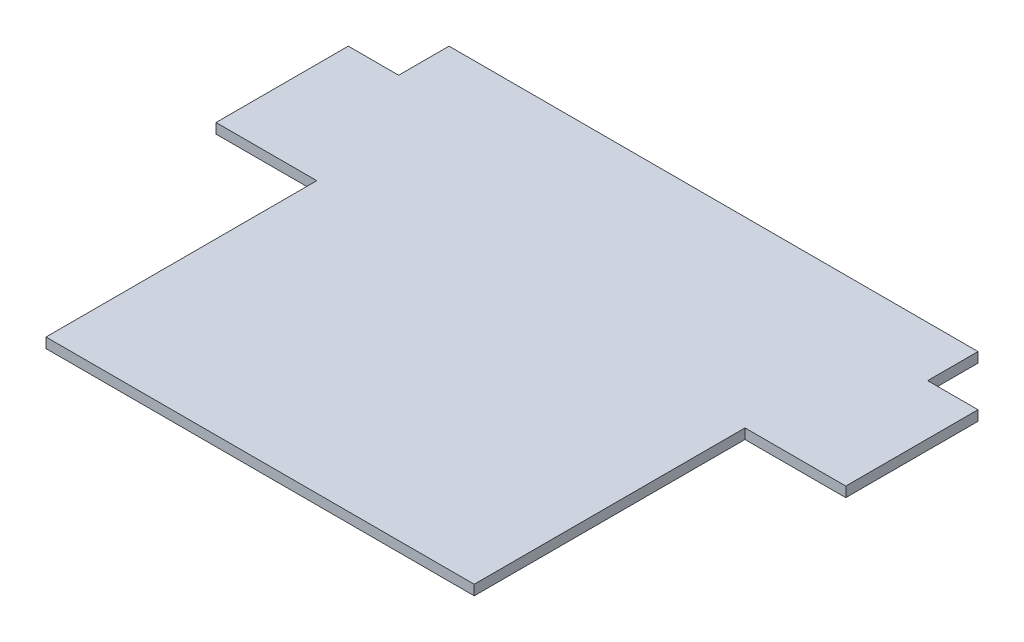
ISO-10303-21;
HEADER;
FILE_DESCRIPTION(('STEP AP214'),'2;1');
FILE_NAME('part.step','',(''),(''),'','','');
FILE_SCHEMA(('AUTOMOTIVE_DESIGN { 1 0 10303 214 1 1 1 1 }'));
ENDSEC;
DATA;
#1=APPLICATION_CONTEXT('core data for automotive mechanical design processes');
#2=APPLICATION_PROTOCOL_DEFINITION('international standard','automotive_design',2000,#1);
#3=PRODUCT_CONTEXT('',#1,'mechanical');
#4=PRODUCT('Part','Part','',(#3));
#5=PRODUCT_RELATED_PRODUCT_CATEGORY('part','',(#4));
#6=PRODUCT_DEFINITION_FORMATION('','',#4);
#7=PRODUCT_DEFINITION_CONTEXT('part definition',#1,'design');
#8=PRODUCT_DEFINITION('design','',#6,#7);
#9=PRODUCT_DEFINITION_SHAPE('','',#8);
#10=(LENGTH_UNIT() NAMED_UNIT(*) SI_UNIT(.MILLI.,.METRE.));
#11=(NAMED_UNIT(*) PLANE_ANGLE_UNIT() SI_UNIT($,.RADIAN.));
#12=(NAMED_UNIT(*) SI_UNIT($,.STERADIAN.) SOLID_ANGLE_UNIT());
#13=UNCERTAINTY_MEASURE_WITH_UNIT(LENGTH_MEASURE(1.E-05),#10,'distance_accuracy_value','');
#14=(GEOMETRIC_REPRESENTATION_CONTEXT(3) GLOBAL_UNCERTAINTY_ASSIGNED_CONTEXT((#13)) GLOBAL_UNIT_ASSIGNED_CONTEXT((#10,
#11,#12)) REPRESENTATION_CONTEXT('',''));
#15=CARTESIAN_POINT('',(0.,0.,0.));
#16=DIRECTION('',(0.,0.,1.));
#17=DIRECTION('',(1.,0.,0.));
#18=AXIS2_PLACEMENT_3D('',#15,#16,#17);
#19=CARTESIAN_POINT('',(-34.,1.6,-43.));
#20=DIRECTION('',(0.,0.,-1.));
#21=DIRECTION('',(-1.,0.,0.));
#22=AXIS2_PLACEMENT_3D('',#19,#20,#21);
#23=PLANE('',#22);
#24=DIRECTION('',(1.,0.,0.));
#25=VECTOR('',#24,1.);
#26=CARTESIAN_POINT('',(-34.,0.,-43.));
#27=LINE('',#26,#25);
#28=CARTESIAN_POINT('',(-50.,0.,-43.));
#29=VERTEX_POINT('',#28);
#30=CARTESIAN_POINT('',(-34.,0.,-43.));
#31=VERTEX_POINT('',#30);
#32=EDGE_CURVE('E153',#29,#31,#27,.T.);
#33=ORIENTED_EDGE('',*,*,#32,.T.);
#34=DIRECTION('',(0.,-1.,0.));
#35=VECTOR('',#34,1.);
#36=CARTESIAN_POINT('',(-34.,1.6,-43.));
#37=LINE('',#36,#35);
#38=CARTESIAN_POINT('',(-34.,1.6,-43.));
#39=VERTEX_POINT('',#38);
#40=EDGE_CURVE('E11',#39,#31,#37,.T.);
#41=ORIENTED_EDGE('',*,*,#40,.F.);
#42=DIRECTION('',(1.,0.,0.));
#43=VECTOR('',#42,1.);
#44=CARTESIAN_POINT('',(-34.,1.6,-43.));
#45=LINE('',#44,#43);
#46=CARTESIAN_POINT('',(-50.,1.6,-43.));
#47=VERTEX_POINT('',#46);
#48=EDGE_CURVE('E175',#47,#39,#45,.T.);
#49=ORIENTED_EDGE('',*,*,#48,.F.);
#50=DIRECTION('',(0.,-1.,0.));
#51=VECTOR('',#50,1.);
#52=CARTESIAN_POINT('',(-50.,1.6,-43.));
#53=LINE('',#52,#51);
#54=EDGE_CURVE('E149',#47,#29,#53,.T.);
#55=ORIENTED_EDGE('',*,*,#54,.T.);
#56=EDGE_LOOP('',(#33,#41,#49,#55));
#57=FACE_BOUND('',#56,.T.);
#58=ADVANCED_FACE('F33',(#57),#23,.F.);
#59=CARTESIAN_POINT('',(-34.,1.6,-43.));
#60=DIRECTION('',(1.,0.,0.));
#61=DIRECTION('',(0.,0.,-1.));
#62=AXIS2_PLACEMENT_3D('',#59,#60,#61);
#63=PLANE('',#62);
#64=DIRECTION('',(0.,0.,1.));
#65=VECTOR('',#64,1.);
#66=CARTESIAN_POINT('',(-34.,0.,-43.));
#67=LINE('',#66,#65);
#68=CARTESIAN_POINT('',(-34.,0.,0.));
#69=VERTEX_POINT('',#68);
#70=EDGE_CURVE('E156',#31,#69,#67,.T.);
#71=ORIENTED_EDGE('',*,*,#70,.T.);
#72=DIRECTION('',(0.,-1.,0.));
#73=VECTOR('',#72,1.);
#74=CARTESIAN_POINT('',(-34.,1.6,0.));
#75=LINE('',#74,#73);
#76=CARTESIAN_POINT('',(-34.,1.6,0.));
#77=VERTEX_POINT('',#76);
#78=EDGE_CURVE('E41',#77,#69,#75,.T.);
#79=ORIENTED_EDGE('',*,*,#78,.F.);
#80=DIRECTION('',(0.,0.,1.));
#81=VECTOR('',#80,1.);
#82=CARTESIAN_POINT('',(-34.,1.6,-43.));
#83=LINE('',#82,#81);
#84=EDGE_CURVE('E104',#39,#77,#83,.T.);
#85=ORIENTED_EDGE('',*,*,#84,.F.);
#86=ORIENTED_EDGE('',*,*,#40,.T.);
#87=EDGE_LOOP('',(#71,#79,#85,#86));
#88=FACE_BOUND('',#87,.T.);
#89=ADVANCED_FACE('F253',(#88),#63,.F.);
#90=CARTESIAN_POINT('',(-34.,1.6,0.));
#91=DIRECTION('',(0.,0.,-1.));
#92=DIRECTION('',(-1.,0.,0.));
#93=AXIS2_PLACEMENT_3D('',#90,#91,#92);
#94=PLANE('',#93);
#95=DIRECTION('',(1.,0.,0.));
#96=VECTOR('',#95,1.);
#97=CARTESIAN_POINT('',(-34.,0.,0.));
#98=LINE('',#97,#96);
#99=CARTESIAN_POINT('',(34.,0.,0.));
#100=VERTEX_POINT('',#99);
#101=EDGE_CURVE('E158',#69,#100,#98,.T.);
#102=ORIENTED_EDGE('',*,*,#101,.T.);
#103=DIRECTION('',(0.,-1.,0.));
#104=VECTOR('',#103,1.);
#105=CARTESIAN_POINT('',(34.,1.6,0.));
#106=LINE('',#105,#104);
#107=CARTESIAN_POINT('',(34.,1.6,0.));
#108=VERTEX_POINT('',#107);
#109=EDGE_CURVE('E194',#108,#100,#106,.T.);
#110=ORIENTED_EDGE('',*,*,#109,.F.);
#111=DIRECTION('',(1.,0.,0.));
#112=VECTOR('',#111,1.);
#113=CARTESIAN_POINT('',(-34.,1.6,0.));
#114=LINE('',#113,#112);
#115=EDGE_CURVE('E202',#77,#108,#114,.T.);
#116=ORIENTED_EDGE('',*,*,#115,.F.);
#117=ORIENTED_EDGE('',*,*,#78,.T.);
#118=EDGE_LOOP('',(#102,#110,#116,#117));
#119=FACE_BOUND('',#118,.T.);
#120=ADVANCED_FACE('F200',(#119),#94,.F.);
#121=CARTESIAN_POINT('',(34.,1.6,-43.));
#122=DIRECTION('',(-1.,0.,0.));
#123=DIRECTION('',(0.,0.,1.));
#124=AXIS2_PLACEMENT_3D('',#121,#122,#123);
#125=PLANE('',#124);
#126=DIRECTION('',(0.,0.,-1.));
#127=VECTOR('',#126,1.);
#128=CARTESIAN_POINT('',(34.,0.,-43.));
#129=LINE('',#128,#127);
#130=CARTESIAN_POINT('',(34.,0.,-43.));
#131=VERTEX_POINT('',#130);
#132=EDGE_CURVE('E160',#100,#131,#129,.T.);
#133=ORIENTED_EDGE('',*,*,#132,.T.);
#134=DIRECTION('',(0.,-1.,0.));
#135=VECTOR('',#134,1.);
#136=CARTESIAN_POINT('',(34.,1.6,-43.));
#137=LINE('',#136,#135);
#138=CARTESIAN_POINT('',(34.,1.6,-43.));
#139=VERTEX_POINT('',#138);
#140=EDGE_CURVE('E191',#139,#131,#137,.T.);
#141=ORIENTED_EDGE('',*,*,#140,.F.);
#142=DIRECTION('',(0.,0.,-1.));
#143=VECTOR('',#142,1.);
#144=CARTESIAN_POINT('',(34.,1.6,-43.));
#145=LINE('',#144,#143);
#146=EDGE_CURVE('E220',#108,#139,#145,.T.);
#147=ORIENTED_EDGE('',*,*,#146,.F.);
#148=ORIENTED_EDGE('',*,*,#109,.T.);
#149=EDGE_LOOP('',(#133,#141,#147,#148));
#150=FACE_BOUND('',#149,.T.);
#151=ADVANCED_FACE('F211',(#150),#125,.F.);
#152=CARTESIAN_POINT('',(34.,1.6,-43.));
#153=DIRECTION('',(0.,0.,-1.));
#154=DIRECTION('',(-1.,0.,0.));
#155=AXIS2_PLACEMENT_3D('',#152,#153,#154);
#156=PLANE('',#155);
#157=DIRECTION('',(1.,0.,0.));
#158=VECTOR('',#157,1.);
#159=CARTESIAN_POINT('',(34.,0.,-43.));
#160=LINE('',#159,#158);
#161=CARTESIAN_POINT('',(50.,0.,-43.));
#162=VERTEX_POINT('',#161);
#163=EDGE_CURVE('E162',#131,#162,#160,.T.);
#164=ORIENTED_EDGE('',*,*,#163,.T.);
#165=DIRECTION('',(0.,-1.,0.));
#166=VECTOR('',#165,1.);
#167=CARTESIAN_POINT('',(50.,1.6,-43.));
#168=LINE('',#167,#166);
#169=CARTESIAN_POINT('',(50.,1.6,-43.));
#170=VERTEX_POINT('',#169);
#171=EDGE_CURVE('E188',#170,#162,#168,.T.);
#172=ORIENTED_EDGE('',*,*,#171,.F.);
#173=DIRECTION('',(1.,0.,0.));
#174=VECTOR('',#173,1.);
#175=CARTESIAN_POINT('',(34.,1.6,-43.));
#176=LINE('',#175,#174);
#177=EDGE_CURVE('E217',#139,#170,#176,.T.);
#178=ORIENTED_EDGE('',*,*,#177,.F.);
#179=ORIENTED_EDGE('',*,*,#140,.T.);
#180=EDGE_LOOP('',(#164,#172,#178,#179));
#181=FACE_BOUND('',#180,.T.);
#182=ADVANCED_FACE('F215',(#181),#156,.F.);
#183=CARTESIAN_POINT('',(50.,1.6,-43.));
#184=DIRECTION('',(-1.,0.,0.));
#185=DIRECTION('',(0.,0.,1.));
#186=AXIS2_PLACEMENT_3D('',#183,#184,#185);
#187=PLANE('',#186);
#188=DIRECTION('',(0.,0.,-1.));
#189=VECTOR('',#188,1.);
#190=CARTESIAN_POINT('',(50.,0.,-43.));
#191=LINE('',#190,#189);
#192=CARTESIAN_POINT('',(50.,0.,-64.));
#193=VERTEX_POINT('',#192);
#194=EDGE_CURVE('E164',#162,#193,#191,.T.);
#195=ORIENTED_EDGE('',*,*,#194,.T.);
#196=DIRECTION('',(0.,-1.,0.));
#197=VECTOR('',#196,1.);
#198=CARTESIAN_POINT('',(50.,1.6,-64.));
#199=LINE('',#198,#197);
#200=CARTESIAN_POINT('',(50.,1.6,-64.));
#201=VERTEX_POINT('',#200);
#202=EDGE_CURVE('E185',#201,#193,#199,.T.);
#203=ORIENTED_EDGE('',*,*,#202,.F.);
#204=DIRECTION('',(0.,0.,-1.));
#205=VECTOR('',#204,1.);
#206=CARTESIAN_POINT('',(50.,1.6,-43.));
#207=LINE('',#206,#205);
#208=EDGE_CURVE('E219',#170,#201,#207,.T.);
#209=ORIENTED_EDGE('',*,*,#208,.F.);
#210=ORIENTED_EDGE('',*,*,#171,.T.);
#211=EDGE_LOOP('',(#195,#203,#209,#210));
#212=FACE_BOUND('',#211,.T.);
#213=ADVANCED_FACE('F266',(#212),#187,.F.);
#214=CARTESIAN_POINT('',(50.,1.6,-64.));
#215=DIRECTION('',(0.,0.,1.));
#216=DIRECTION('',(1.,0.,0.));
#217=AXIS2_PLACEMENT_3D('',#214,#215,#216);
#218=PLANE('',#217);
#219=DIRECTION('',(-1.,0.,0.));
#220=VECTOR('',#219,1.);
#221=CARTESIAN_POINT('',(50.,0.,-64.));
#222=LINE('',#221,#220);
#223=CARTESIAN_POINT('',(42.,0.,-64.));
#224=VERTEX_POINT('',#223);
#225=EDGE_CURVE('E166',#193,#224,#222,.T.);
#226=ORIENTED_EDGE('',*,*,#225,.T.);
#227=DIRECTION('',(0.,-1.,0.));
#228=VECTOR('',#227,1.);
#229=CARTESIAN_POINT('',(42.,1.6,-64.));
#230=LINE('',#229,#228);
#231=CARTESIAN_POINT('',(42.,1.6,-64.));
#232=VERTEX_POINT('',#231);
#233=EDGE_CURVE('E182',#232,#224,#230,.T.);
#234=ORIENTED_EDGE('',*,*,#233,.F.);
#235=DIRECTION('',(-1.,0.,0.));
#236=VECTOR('',#235,1.);
#237=CARTESIAN_POINT('',(50.,1.6,-64.));
#238=LINE('',#237,#236);
#239=EDGE_CURVE('E222',#201,#232,#238,.T.);
#240=ORIENTED_EDGE('',*,*,#239,.F.);
#241=ORIENTED_EDGE('',*,*,#202,.T.);
#242=EDGE_LOOP('',(#226,#234,#240,#241));
#243=FACE_BOUND('',#242,.T.);
#244=ADVANCED_FACE('F269',(#243),#218,.F.);
#245=CARTESIAN_POINT('',(42.,1.6,-64.));
#246=DIRECTION('',(-1.,0.,0.));
#247=DIRECTION('',(0.,0.,1.));
#248=AXIS2_PLACEMENT_3D('',#245,#246,#247);
#249=PLANE('',#248);
#250=DIRECTION('',(0.,0.,-1.));
#251=VECTOR('',#250,1.);
#252=CARTESIAN_POINT('',(42.,0.,-64.));
#253=LINE('',#252,#251);
#254=CARTESIAN_POINT('',(42.,0.,-72.));
#255=VERTEX_POINT('',#254);
#256=EDGE_CURVE('E168',#224,#255,#253,.T.);
#257=ORIENTED_EDGE('',*,*,#256,.T.);
#258=DIRECTION('',(0.,-1.,0.));
#259=VECTOR('',#258,1.);
#260=CARTESIAN_POINT('',(42.,1.6,-72.));
#261=LINE('',#260,#259);
#262=CARTESIAN_POINT('',(42.,1.6,-72.));
#263=VERTEX_POINT('',#262);
#264=EDGE_CURVE('E179',#263,#255,#261,.T.);
#265=ORIENTED_EDGE('',*,*,#264,.F.);
#266=DIRECTION('',(0.,0.,-1.));
#267=VECTOR('',#266,1.);
#268=CARTESIAN_POINT('',(42.,1.6,-64.));
#269=LINE('',#268,#267);
#270=EDGE_CURVE('E228',#232,#263,#269,.T.);
#271=ORIENTED_EDGE('',*,*,#270,.F.);
#272=ORIENTED_EDGE('',*,*,#233,.T.);
#273=EDGE_LOOP('',(#257,#265,#271,#272));
#274=FACE_BOUND('',#273,.T.);
#275=ADVANCED_FACE('F234',(#274),#249,.F.);
#276=CARTESIAN_POINT('',(-42.,1.6,-72.));
#277=DIRECTION('',(0.,0.,1.));
#278=DIRECTION('',(1.,0.,0.));
#279=AXIS2_PLACEMENT_3D('',#276,#277,#278);
#280=PLANE('',#279);
#281=DIRECTION('',(-1.,0.,0.));
#282=VECTOR('',#281,1.);
#283=CARTESIAN_POINT('',(-42.,0.,-72.));
#284=LINE('',#283,#282);
#285=CARTESIAN_POINT('',(-42.,0.,-72.));
#286=VERTEX_POINT('',#285);
#287=EDGE_CURVE('E170',#255,#286,#284,.T.);
#288=ORIENTED_EDGE('',*,*,#287,.T.);
#289=DIRECTION('',(0.,-1.,0.));
#290=VECTOR('',#289,1.);
#291=CARTESIAN_POINT('',(-42.,1.6,-72.));
#292=LINE('',#291,#290);
#293=CARTESIAN_POINT('',(-42.,1.6,-72.));
#294=VERTEX_POINT('',#293);
#295=EDGE_CURVE('E144',#294,#286,#292,.T.);
#296=ORIENTED_EDGE('',*,*,#295,.F.);
#297=DIRECTION('',(-1.,0.,0.));
#298=VECTOR('',#297,1.);
#299=CARTESIAN_POINT('',(-42.,1.6,-72.));
#300=LINE('',#299,#298);
#301=EDGE_CURVE('E135',#263,#294,#300,.T.);
#302=ORIENTED_EDGE('',*,*,#301,.F.);
#303=ORIENTED_EDGE('',*,*,#264,.T.);
#304=EDGE_LOOP('',(#288,#296,#302,#303));
#305=FACE_BOUND('',#304,.T.);
#306=ADVANCED_FACE('F238',(#305),#280,.F.);
#307=CARTESIAN_POINT('',(-42.,1.6,-64.));
#308=DIRECTION('',(1.,0.,0.));
#309=DIRECTION('',(0.,0.,-1.));
#310=AXIS2_PLACEMENT_3D('',#307,#308,#309);
#311=PLANE('',#310);
#312=DIRECTION('',(0.,0.,1.));
#313=VECTOR('',#312,1.);
#314=CARTESIAN_POINT('',(-42.,0.,-64.));
#315=LINE('',#314,#313);
#316=CARTESIAN_POINT('',(-42.,0.,-64.));
#317=VERTEX_POINT('',#316);
#318=EDGE_CURVE('E143',#286,#317,#315,.T.);
#319=ORIENTED_EDGE('',*,*,#318,.T.);
#320=DIRECTION('',(0.,-1.,0.));
#321=VECTOR('',#320,1.);
#322=CARTESIAN_POINT('',(-42.,1.6,-64.));
#323=LINE('',#322,#321);
#324=CARTESIAN_POINT('',(-42.,1.6,-64.));
#325=VERTEX_POINT('',#324);
#326=EDGE_CURVE('E140',#325,#317,#323,.T.);
#327=ORIENTED_EDGE('',*,*,#326,.F.);
#328=DIRECTION('',(0.,0.,1.));
#329=VECTOR('',#328,1.);
#330=CARTESIAN_POINT('',(-42.,1.6,-64.));
#331=LINE('',#330,#329);
#332=EDGE_CURVE('E129',#294,#325,#331,.T.);
#333=ORIENTED_EDGE('',*,*,#332,.F.);
#334=ORIENTED_EDGE('',*,*,#295,.T.);
#335=EDGE_LOOP('',(#319,#327,#333,#334));
#336=FACE_BOUND('',#335,.T.);
#337=ADVANCED_FACE('F141',(#336),#311,.F.);
#338=CARTESIAN_POINT('',(-50.,1.6,-64.));
#339=DIRECTION('',(0.,0.,1.));
#340=DIRECTION('',(1.,0.,0.));
#341=AXIS2_PLACEMENT_3D('',#338,#339,#340);
#342=PLANE('',#341);
#343=DIRECTION('',(-1.,0.,0.));
#344=VECTOR('',#343,1.);
#345=CARTESIAN_POINT('',(-50.,0.,-64.));
#346=LINE('',#345,#344);
#347=CARTESIAN_POINT('',(-50.,0.,-64.));
#348=VERTEX_POINT('',#347);
#349=EDGE_CURVE('E90',#317,#348,#346,.T.);
#350=ORIENTED_EDGE('',*,*,#349,.T.);
#351=DIRECTION('',(0.,-1.,0.));
#352=VECTOR('',#351,1.);
#353=CARTESIAN_POINT('',(-50.,1.6,-64.));
#354=LINE('',#353,#352);
#355=CARTESIAN_POINT('',(-50.,1.6,-64.));
#356=VERTEX_POINT('',#355);
#357=EDGE_CURVE('E145',#356,#348,#354,.T.);
#358=ORIENTED_EDGE('',*,*,#357,.F.);
#359=DIRECTION('',(-1.,0.,0.));
#360=VECTOR('',#359,1.);
#361=CARTESIAN_POINT('',(-50.,1.6,-64.));
#362=LINE('',#361,#360);
#363=EDGE_CURVE('E133',#325,#356,#362,.T.);
#364=ORIENTED_EDGE('',*,*,#363,.F.);
#365=ORIENTED_EDGE('',*,*,#326,.T.);
#366=EDGE_LOOP('',(#350,#358,#364,#365));
#367=FACE_BOUND('',#366,.T.);
#368=ADVANCED_FACE('F147',(#367),#342,.F.);
#369=CARTESIAN_POINT('',(-50.,1.6,-43.));
#370=DIRECTION('',(1.,0.,0.));
#371=DIRECTION('',(0.,0.,-1.));
#372=AXIS2_PLACEMENT_3D('',#369,#370,#371);
#373=PLANE('',#372);
#374=DIRECTION('',(0.,0.,1.));
#375=VECTOR('',#374,1.);
#376=CARTESIAN_POINT('',(-50.,0.,-43.));
#377=LINE('',#376,#375);
#378=EDGE_CURVE('E96',#348,#29,#377,.T.);
#379=ORIENTED_EDGE('',*,*,#378,.T.);
#380=ORIENTED_EDGE('',*,*,#54,.F.);
#381=DIRECTION('',(0.,0.,1.));
#382=VECTOR('',#381,1.);
#383=CARTESIAN_POINT('',(-50.,1.6,-43.));
#384=LINE('',#383,#382);
#385=EDGE_CURVE('E49',#356,#47,#384,.T.);
#386=ORIENTED_EDGE('',*,*,#385,.F.);
#387=ORIENTED_EDGE('',*,*,#357,.T.);
#388=EDGE_LOOP('',(#379,#380,#386,#387));
#389=FACE_BOUND('',#388,.T.);
#390=ADVANCED_FACE('F242',(#389),#373,.F.);
#391=CARTESIAN_POINT('',(0.,1.6,0.));
#392=DIRECTION('',(0.,-1.,0.));
#393=DIRECTION('',(0.,0.,-1.));
#394=AXIS2_PLACEMENT_3D('',#391,#392,#393);
#395=PLANE('',#394);
#396=ORIENTED_EDGE('',*,*,#48,.T.);
#397=ORIENTED_EDGE('',*,*,#84,.T.);
#398=ORIENTED_EDGE('',*,*,#115,.T.);
#399=ORIENTED_EDGE('',*,*,#146,.T.);
#400=ORIENTED_EDGE('',*,*,#177,.T.);
#401=ORIENTED_EDGE('',*,*,#208,.T.);
#402=ORIENTED_EDGE('',*,*,#239,.T.);
#403=ORIENTED_EDGE('',*,*,#270,.T.);
#404=ORIENTED_EDGE('',*,*,#301,.T.);
#405=ORIENTED_EDGE('',*,*,#332,.T.);
#406=ORIENTED_EDGE('',*,*,#363,.T.);
#407=ORIENTED_EDGE('',*,*,#385,.T.);
#408=EDGE_LOOP('',(#396,#397,#398,#399,#400,#401,#402,#403,#404,#405,#406,#407));
#409=FACE_BOUND('',#408,.T.);
#410=ADVANCED_FACE('F131',(#409),#395,.F.);
#411=CARTESIAN_POINT('',(0.,0.,0.));
#412=DIRECTION('',(0.,-1.,0.));
#413=DIRECTION('',(0.,0.,-1.));
#414=AXIS2_PLACEMENT_3D('',#411,#412,#413);
#415=PLANE('',#414);
#416=ORIENTED_EDGE('',*,*,#32,.F.);
#417=ORIENTED_EDGE('',*,*,#378,.F.);
#418=ORIENTED_EDGE('',*,*,#349,.F.);
#419=ORIENTED_EDGE('',*,*,#318,.F.);
#420=ORIENTED_EDGE('',*,*,#287,.F.);
#421=ORIENTED_EDGE('',*,*,#256,.F.);
#422=ORIENTED_EDGE('',*,*,#225,.F.);
#423=ORIENTED_EDGE('',*,*,#194,.F.);
#424=ORIENTED_EDGE('',*,*,#163,.F.);
#425=ORIENTED_EDGE('',*,*,#132,.F.);
#426=ORIENTED_EDGE('',*,*,#101,.F.);
#427=ORIENTED_EDGE('',*,*,#70,.F.);
#428=EDGE_LOOP('',(#416,#417,#418,#419,#420,#421,#422,#423,#424,#425,#426,#427));
#429=FACE_BOUND('',#428,.T.);
#430=ADVANCED_FACE('F206',(#429),#415,.T.);
#431=CLOSED_SHELL('',(#58,#89,#120,#151,#182,#213,#244,#275,#306,#337,#368,#390,#410,#430));
#432=MANIFOLD_SOLID_BREP('B2',#431);
#433=ADVANCED_BREP_SHAPE_REPRESENTATION('',(#18,#432),#14);
#434=SHAPE_DEFINITION_REPRESENTATION(#9,#433);
ENDSEC;
END-ISO-10303-21;
